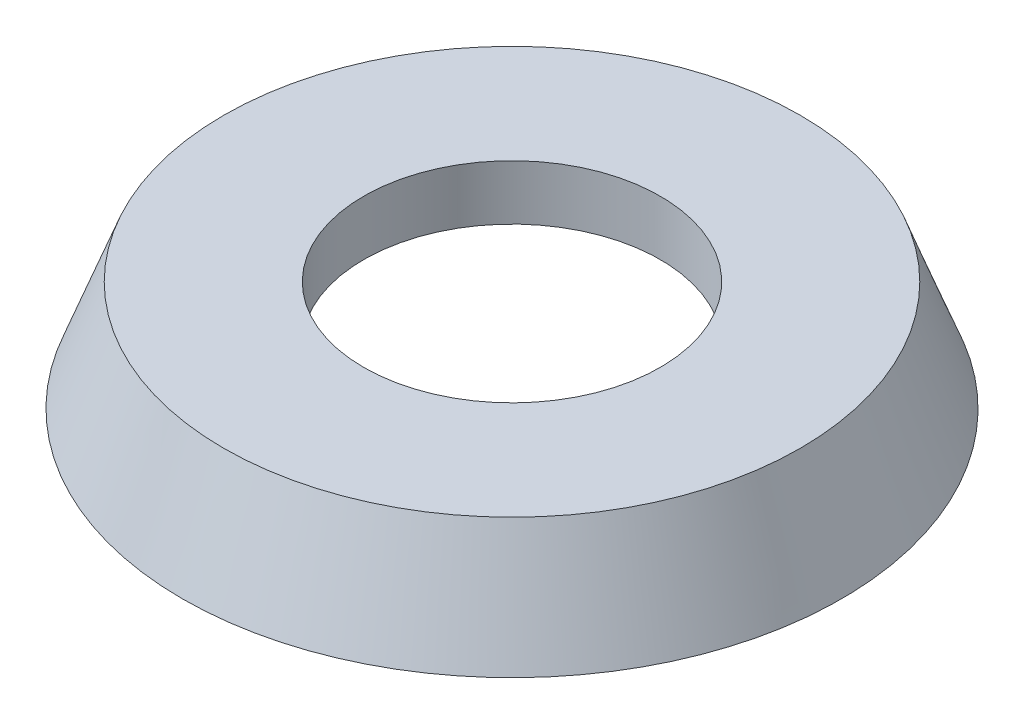
ISO-10303-21;
HEADER;
FILE_DESCRIPTION(('STEP AP214'),'2;1');
FILE_NAME('part.step','',(''),(''),'','','');
FILE_SCHEMA(('AUTOMOTIVE_DESIGN { 1 0 10303 214 1 1 1 1 }'));
ENDSEC;
DATA;
#1=APPLICATION_CONTEXT('core data for automotive mechanical design processes');
#2=APPLICATION_PROTOCOL_DEFINITION('international standard','automotive_design',2000,#1);
#3=PRODUCT_CONTEXT('',#1,'mechanical');
#4=PRODUCT('Part','Part','',(#3));
#5=PRODUCT_RELATED_PRODUCT_CATEGORY('part','',(#4));
#6=PRODUCT_DEFINITION_FORMATION('','',#4);
#7=PRODUCT_DEFINITION_CONTEXT('part definition',#1,'design');
#8=PRODUCT_DEFINITION('design','',#6,#7);
#9=PRODUCT_DEFINITION_SHAPE('','',#8);
#10=(LENGTH_UNIT() NAMED_UNIT(*) SI_UNIT(.MILLI.,.METRE.));
#11=(NAMED_UNIT(*) PLANE_ANGLE_UNIT() SI_UNIT($,.RADIAN.));
#12=(NAMED_UNIT(*) SI_UNIT($,.STERADIAN.) SOLID_ANGLE_UNIT());
#13=UNCERTAINTY_MEASURE_WITH_UNIT(LENGTH_MEASURE(1.E-05),#10,'distance_accuracy_value','');
#14=(GEOMETRIC_REPRESENTATION_CONTEXT(3) GLOBAL_UNCERTAINTY_ASSIGNED_CONTEXT((#13)) GLOBAL_UNIT_ASSIGNED_CONTEXT((#10,
#11,#12)) REPRESENTATION_CONTEXT('',''));
#15=CARTESIAN_POINT('',(0.,0.,0.));
#16=DIRECTION('',(0.,0.,1.));
#17=DIRECTION('',(1.,0.,0.));
#18=AXIS2_PLACEMENT_3D('',#15,#16,#17);
#19=CARTESIAN_POINT('',(0.,4.,0.));
#20=DIRECTION('',(0.,1.,0.));
#21=DIRECTION('',(0.,0.,1.));
#22=AXIS2_PLACEMENT_3D('',#19,#20,#21);
#23=PLANE('',#22);
#24=CARTESIAN_POINT('',(0.,4.,0.));
#25=DIRECTION('',(0.,1.,0.));
#26=DIRECTION('',(0.,0.,1.));
#27=AXIS2_PLACEMENT_3D('',#24,#25,#26);
#28=CIRCLE('',#27,5.4);
#29=CARTESIAN_POINT('',(0.,4.,5.4));
#30=VERTEX_POINT('',#29);
#31=EDGE_CURVE('E114',#30,#30,#28,.T.);
#32=ORIENTED_EDGE('',*,*,#31,.F.);
#33=EDGE_LOOP('',(#32));
#34=FACE_BOUND('',#33,.T.);
#35=CARTESIAN_POINT('',(0.,4.,0.));
#36=DIRECTION('',(0.,1.,0.));
#37=DIRECTION('',(0.,0.,1.));
#38=AXIS2_PLACEMENT_3D('',#35,#36,#37);
#39=CIRCLE('',#38,10.5);
#40=CARTESIAN_POINT('',(0.,4.,10.5));
#41=VERTEX_POINT('',#40);
#42=EDGE_CURVE('E45',#41,#41,#39,.T.);
#43=ORIENTED_EDGE('',*,*,#42,.T.);
#44=EDGE_LOOP('',(#43));
#45=FACE_BOUND('',#44,.T.);
#46=ADVANCED_FACE('F37',(#34,#45),#23,.T.);
#47=CARTESIAN_POINT('',(0.,0.,0.));
#48=DIRECTION('',(0.,1.,0.));
#49=DIRECTION('',(0.,0.,1.));
#50=AXIS2_PLACEMENT_3D('',#47,#48,#49);
#51=PLANE('',#50);
#52=CARTESIAN_POINT('',(0.,0.,0.));
#53=DIRECTION('',(0.,1.,0.));
#54=DIRECTION('',(0.,0.,1.));
#55=AXIS2_PLACEMENT_3D('',#52,#53,#54);
#56=CIRCLE('',#55,9.86399906367062);
#57=CARTESIAN_POINT('',(0.,0.,9.86399906367062));
#58=VERTEX_POINT('',#57);
#59=EDGE_CURVE('E51',#58,#58,#56,.T.);
#60=ORIENTED_EDGE('',*,*,#59,.T.);
#61=EDGE_LOOP('',(#60));
#62=FACE_BOUND('',#61,.T.);
#63=CARTESIAN_POINT('',(0.,0.,0.));
#64=DIRECTION('',(0.,1.,0.));
#65=DIRECTION('',(0.,0.,1.));
#66=AXIS2_PLACEMENT_3D('',#63,#64,#65);
#67=CIRCLE('',#66,12.);
#68=CARTESIAN_POINT('',(0.,0.,12.));
#69=VERTEX_POINT('',#68);
#70=EDGE_CURVE('E11',#69,#69,#67,.T.);
#71=ORIENTED_EDGE('',*,*,#70,.F.);
#72=EDGE_LOOP('',(#71));
#73=FACE_BOUND('',#72,.T.);
#74=ADVANCED_FACE('F89',(#62,#73),#51,.F.);
#75=CARTESIAN_POINT('',(0.,4.,0.));
#76=DIRECTION('',(0.,-1.,0.));
#77=DIRECTION('',(0.,0.,-1.));
#78=AXIS2_PLACEMENT_3D('',#75,#76,#77);
#79=CONICAL_SURFACE('',#78,10.5,0.358770670270572);
#80=ORIENTED_EDGE('',*,*,#70,.T.);
#81=EDGE_LOOP('',(#80));
#82=FACE_BOUND('',#81,.T.);
#83=ORIENTED_EDGE('',*,*,#42,.F.);
#84=EDGE_LOOP('',(#83));
#85=FACE_BOUND('',#84,.T.);
#86=ADVANCED_FACE('F74',(#82,#85),#79,.T.);
#87=CARTESIAN_POINT('',(0.,2.,0.));
#88=DIRECTION('',(0.,1.,0.));
#89=DIRECTION('',(0.,0.,1.));
#90=AXIS2_PLACEMENT_3D('',#87,#88,#89);
#91=PLANE('',#90);
#92=CARTESIAN_POINT('',(0.,2.,0.));
#93=DIRECTION('',(0.,1.,0.));
#94=DIRECTION('',(0.,0.,1.));
#95=AXIS2_PLACEMENT_3D('',#92,#93,#94);
#96=CIRCLE('',#95,5.4);
#97=CARTESIAN_POINT('',(0.,2.,5.4));
#98=VERTEX_POINT('',#97);
#99=EDGE_CURVE('E41',#98,#98,#96,.T.);
#100=ORIENTED_EDGE('',*,*,#99,.T.);
#101=EDGE_LOOP('',(#100));
#102=FACE_BOUND('',#101,.T.);
#103=CARTESIAN_POINT('',(0.,2.,0.));
#104=DIRECTION('',(0.,1.,0.));
#105=DIRECTION('',(0.,0.,1.));
#106=AXIS2_PLACEMENT_3D('',#103,#104,#105);
#107=CIRCLE('',#106,9.11399906367062);
#108=CARTESIAN_POINT('',(0.,2.,9.11399906367062));
#109=VERTEX_POINT('',#108);
#110=EDGE_CURVE('E117',#109,#109,#107,.T.);
#111=ORIENTED_EDGE('',*,*,#110,.F.);
#112=EDGE_LOOP('',(#111));
#113=FACE_BOUND('',#112,.T.);
#114=ADVANCED_FACE('F88',(#102,#113),#91,.F.);
#115=CARTESIAN_POINT('',(0.,3.29775311682322,0.));
#116=DIRECTION('',(0.,-1.,0.));
#117=DIRECTION('',(0.,0.,-1.));
#118=AXIS2_PLACEMENT_3D('',#115,#116,#117);
#119=CONICAL_SURFACE('',#118,8.62734164486191,0.358770670270572);
#120=ORIENTED_EDGE('',*,*,#59,.F.);
#121=EDGE_LOOP('',(#120));
#122=FACE_BOUND('',#121,.T.);
#123=ORIENTED_EDGE('',*,*,#110,.T.);
#124=EDGE_LOOP('',(#123));
#125=FACE_BOUND('',#124,.T.);
#126=ADVANCED_FACE('F95',(#122,#125),#119,.F.);
#127=CARTESIAN_POINT('',(0.,-0.000100000000000273,0.));
#128=DIRECTION('',(0.,1.,0.));
#129=DIRECTION('',(0.,0.,1.));
#130=AXIS2_PLACEMENT_3D('',#127,#128,#129);
#131=CYLINDRICAL_SURFACE('',#130,5.4);
#132=ORIENTED_EDGE('',*,*,#31,.T.);
#133=EDGE_LOOP('',(#132));
#134=FACE_BOUND('',#133,.T.);
#135=ORIENTED_EDGE('',*,*,#99,.F.);
#136=EDGE_LOOP('',(#135));
#137=FACE_BOUND('',#136,.T.);
#138=ADVANCED_FACE('F98',(#134,#137),#131,.F.);
#139=CLOSED_SHELL('',(#46,#74,#86,#114,#126,#138));
#140=MANIFOLD_SOLID_BREP('B2',#139);
#141=ADVANCED_BREP_SHAPE_REPRESENTATION('',(#18,#140),#14);
#142=SHAPE_DEFINITION_REPRESENTATION(#9,#141);
ENDSEC;
END-ISO-10303-21;
